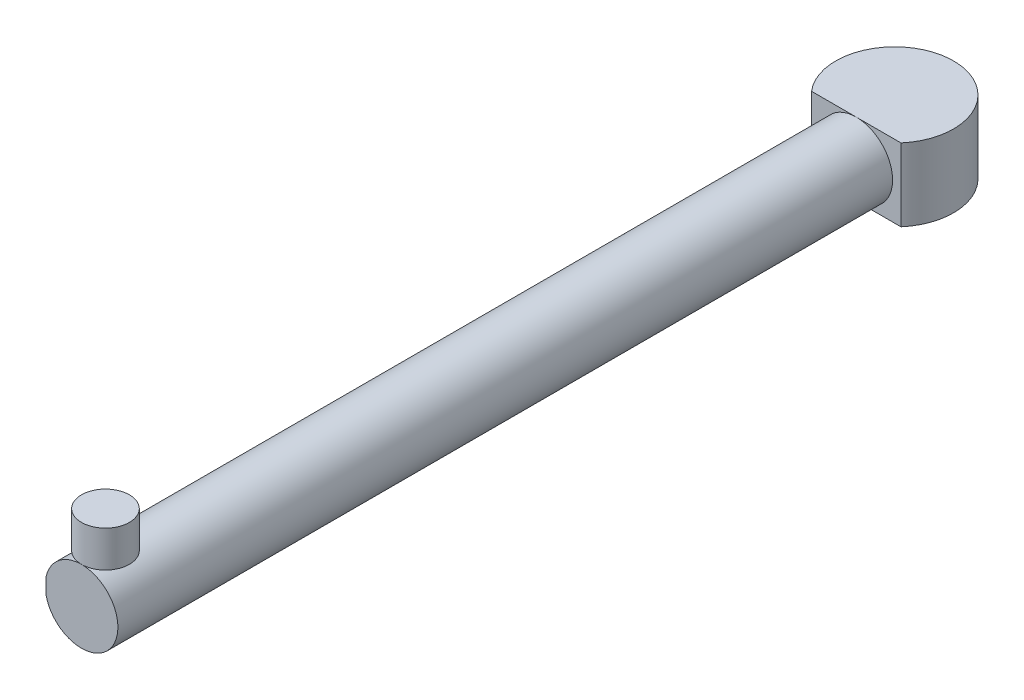
ISO-10303-21;
HEADER;
FILE_DESCRIPTION(('STEP AP214'),'2;1');
FILE_NAME('part.step','',(''),(''),'','','');
FILE_SCHEMA(('AUTOMOTIVE_DESIGN { 1 0 10303 214 1 1 1 1 }'));
ENDSEC;
DATA;
#1=APPLICATION_CONTEXT('core data for automotive mechanical design processes');
#2=APPLICATION_PROTOCOL_DEFINITION('international standard','automotive_design',2000,#1);
#3=PRODUCT_CONTEXT('',#1,'mechanical');
#4=PRODUCT('Part','Part','',(#3));
#5=PRODUCT_RELATED_PRODUCT_CATEGORY('part','',(#4));
#6=PRODUCT_DEFINITION_FORMATION('','',#4);
#7=PRODUCT_DEFINITION_CONTEXT('part definition',#1,'design');
#8=PRODUCT_DEFINITION('design','',#6,#7);
#9=PRODUCT_DEFINITION_SHAPE('','',#8);
#10=(LENGTH_UNIT() NAMED_UNIT(*) SI_UNIT(.MILLI.,.METRE.));
#11=(NAMED_UNIT(*) PLANE_ANGLE_UNIT() SI_UNIT($,.RADIAN.));
#12=(NAMED_UNIT(*) SI_UNIT($,.STERADIAN.) SOLID_ANGLE_UNIT());
#13=UNCERTAINTY_MEASURE_WITH_UNIT(LENGTH_MEASURE(1.E-05),#10,'distance_accuracy_value','');
#14=(GEOMETRIC_REPRESENTATION_CONTEXT(3) GLOBAL_UNCERTAINTY_ASSIGNED_CONTEXT((#13)) GLOBAL_UNIT_ASSIGNED_CONTEXT((#10,
#11,#12)) REPRESENTATION_CONTEXT('',''));
#15=CARTESIAN_POINT('',(0.,0.,0.));
#16=DIRECTION('',(0.,0.,1.));
#17=DIRECTION('',(1.,0.,0.));
#18=AXIS2_PLACEMENT_3D('',#15,#16,#17);
#19=CARTESIAN_POINT('',(10.,30.,89.0052774013303));
#20=DIRECTION('',(0.,0.,-1.));
#21=DIRECTION('',(-1.,0.,0.));
#22=AXIS2_PLACEMENT_3D('',#19,#20,#21);
#23=PLANE('',#22);
#24=CARTESIAN_POINT('',(0.,10.,89.0052774013303));
#25=DIRECTION('',(0.,0.,-1.));
#26=DIRECTION('',(-1.,0.,0.));
#27=AXIS2_PLACEMENT_3D('',#24,#25,#26);
#28=CIRCLE('',#27,10.);
#29=CARTESIAN_POINT('',(-9.77221690676681,12.122210339976,89.0052774013303));
#30=VERTEX_POINT('',#29);
#31=CARTESIAN_POINT('',(-9.7722169067668,7.87778966002397,89.0052774013303));
#32=VERTEX_POINT('',#31);
#33=EDGE_CURVE('E129',#30,#32,#28,.T.);
#34=ORIENTED_EDGE('',*,*,#33,.F.);
#35=DIRECTION('',(0.,-1.,0.));
#36=VECTOR('',#35,1.);
#37=CARTESIAN_POINT('',(-9.7722169067668,30.,89.0052774013303));
#38=LINE('',#37,#36);
#39=EDGE_CURVE('E209',#30,#32,#38,.T.);
#40=ORIENTED_EDGE('',*,*,#39,.T.);
#41=EDGE_LOOP('',(#34,#40));
#42=FACE_BOUND('',#41,.T.);
#43=ADVANCED_FACE('F113',(#42),#23,.F.);
#44=CARTESIAN_POINT('',(-9.7722169067668,30.,75.8317862245712));
#45=DIRECTION('',(1.,0.,0.));
#46=DIRECTION('',(0.,0.,-1.));
#47=AXIS2_PLACEMENT_3D('',#44,#45,#46);
#48=PLANE('',#47);
#49=DIRECTION('',(0.,0.,-1.));
#50=VECTOR('',#49,1.);
#51=CARTESIAN_POINT('',(-9.77221690676681,12.122210339976,109.831786224571));
#52=LINE('',#51,#50);
#53=CARTESIAN_POINT('',(-9.77221690676681,12.122210339976,75.8317862245712));
#54=VERTEX_POINT('',#53);
#55=EDGE_CURVE('E116',#30,#54,#52,.T.);
#56=ORIENTED_EDGE('',*,*,#55,.T.);
#57=DIRECTION('',(0.,-1.,0.));
#58=VECTOR('',#57,1.);
#59=CARTESIAN_POINT('',(-9.7722169067668,30.,75.8317862245712));
#60=LINE('',#59,#58);
#61=CARTESIAN_POINT('',(-9.7722169067668,7.87778966002397,75.8317862245712));
#62=VERTEX_POINT('',#61);
#63=EDGE_CURVE('E193',#54,#62,#60,.T.);
#64=ORIENTED_EDGE('',*,*,#63,.T.);
#65=DIRECTION('',(0.,0.,-1.));
#66=VECTOR('',#65,1.);
#67=CARTESIAN_POINT('',(-9.7722169067668,7.87778966002397,109.831786224571));
#68=LINE('',#67,#66);
#69=EDGE_CURVE('E205',#32,#62,#68,.T.);
#70=ORIENTED_EDGE('',*,*,#69,.F.);
#71=ORIENTED_EDGE('',*,*,#39,.F.);
#72=EDGE_LOOP('',(#56,#64,#70,#71));
#73=FACE_BOUND('',#72,.T.);
#74=ADVANCED_FACE('F224',(#73),#48,.F.);
#75=CARTESIAN_POINT('',(12.3032134622241,20.,75.8317862245712));
#76=DIRECTION('',(0.,0.,1.));
#77=DIRECTION('',(1.,0.,0.));
#78=AXIS2_PLACEMENT_3D('',#75,#76,#77);
#79=PLANE('',#78);
#80=ORIENTED_EDGE('',*,*,#63,.F.);
#81=CARTESIAN_POINT('',(0.,10.,75.8317862245712));
#82=DIRECTION('',(0.,0.,1.));
#83=DIRECTION('',(1.,0.,0.));
#84=AXIS2_PLACEMENT_3D('',#81,#82,#83);
#85=CIRCLE('',#84,10.);
#86=EDGE_CURVE('E188',#54,#62,#85,.T.);
#87=ORIENTED_EDGE('',*,*,#86,.T.);
#88=EDGE_LOOP('',(#80,#87));
#89=FACE_BOUND('',#88,.T.);
#90=ADVANCED_FACE('F223',(#89),#79,.T.);
#91=CARTESIAN_POINT('',(0.,20.,-134.735510149278));
#92=DIRECTION('',(0.,1.,0.));
#93=DIRECTION('',(0.,0.,1.));
#94=AXIS2_PLACEMENT_3D('',#91,#92,#93);
#95=PLANE('',#94);
#96=DIRECTION('',(-1.,0.,0.));
#97=VECTOR('',#96,1.);
#98=CARTESIAN_POINT('',(0.,20.,-124.168213775429));
#99=LINE('',#98,#97);
#100=CARTESIAN_POINT('',(0.,20.,-124.168213775429));
#101=VERTEX_POINT('',#100);
#102=CARTESIAN_POINT('',(-12.3032134622241,20.,-124.168213775429));
#103=VERTEX_POINT('',#102);
#104=EDGE_CURVE('E164',#101,#103,#99,.T.);
#105=ORIENTED_EDGE('',*,*,#104,.F.);
#106=DIRECTION('',(-1.,0.,0.));
#107=VECTOR('',#106,1.);
#108=CARTESIAN_POINT('',(0.,20.,-124.168213775429));
#109=LINE('',#108,#107);
#110=CARTESIAN_POINT('',(12.3032134622241,20.,-124.168213775429));
#111=VERTEX_POINT('',#110);
#112=EDGE_CURVE('E13',#111,#101,#109,.T.);
#113=ORIENTED_EDGE('',*,*,#112,.F.);
#114=CARTESIAN_POINT('',(0.,20.,-134.735510149278));
#115=DIRECTION('',(0.,1.,0.));
#116=DIRECTION('',(0.,0.,1.));
#117=AXIS2_PLACEMENT_3D('',#114,#115,#116);
#118=CIRCLE('',#117,16.2184097293728);
#119=EDGE_CURVE('E183',#111,#103,#118,.T.);
#120=ORIENTED_EDGE('',*,*,#119,.T.);
#121=EDGE_LOOP('',(#105,#113,#120));
#122=FACE_BOUND('',#121,.T.);
#123=ADVANCED_FACE('F233',(#122),#95,.T.);
#124=CARTESIAN_POINT('',(0.,0.,-134.735510149278));
#125=DIRECTION('',(0.,1.,0.));
#126=DIRECTION('',(0.,0.,1.));
#127=AXIS2_PLACEMENT_3D('',#124,#125,#126);
#128=PLANE('',#127);
#129=DIRECTION('',(1.,0.,0.));
#130=VECTOR('',#129,1.);
#131=CARTESIAN_POINT('',(0.,0.,-124.168213775429));
#132=LINE('',#131,#130);
#133=CARTESIAN_POINT('',(0.,0.,-124.168213775429));
#134=VERTEX_POINT('',#133);
#135=CARTESIAN_POINT('',(12.3032134622241,0.,-124.168213775429));
#136=VERTEX_POINT('',#135);
#137=EDGE_CURVE('E123',#134,#136,#132,.T.);
#138=ORIENTED_EDGE('',*,*,#137,.F.);
#139=DIRECTION('',(1.,0.,0.));
#140=VECTOR('',#139,1.);
#141=CARTESIAN_POINT('',(0.,0.,-124.168213775429));
#142=LINE('',#141,#140);
#143=CARTESIAN_POINT('',(-12.3032134622241,0.,-124.168213775429));
#144=VERTEX_POINT('',#143);
#145=EDGE_CURVE('E162',#144,#134,#142,.T.);
#146=ORIENTED_EDGE('',*,*,#145,.F.);
#147=CARTESIAN_POINT('',(0.,0.,-134.735510149278));
#148=DIRECTION('',(0.,1.,0.));
#149=DIRECTION('',(0.,0.,1.));
#150=AXIS2_PLACEMENT_3D('',#147,#148,#149);
#151=CIRCLE('',#150,16.2184097293728);
#152=EDGE_CURVE('E175',#136,#144,#151,.T.);
#153=ORIENTED_EDGE('',*,*,#152,.F.);
#154=EDGE_LOOP('',(#138,#146,#153));
#155=FACE_BOUND('',#154,.T.);
#156=ADVANCED_FACE('F174',(#155),#128,.F.);
#157=CARTESIAN_POINT('',(0.,20.,-134.735510149278));
#158=DIRECTION('',(0.,-1.,0.));
#159=DIRECTION('',(0.,0.,-1.));
#160=AXIS2_PLACEMENT_3D('',#157,#158,#159);
#161=CYLINDRICAL_SURFACE('',#160,16.2184097293728);
#162=ORIENTED_EDGE('',*,*,#152,.T.);
#163=DIRECTION('',(0.,-1.,0.));
#164=VECTOR('',#163,1.);
#165=CARTESIAN_POINT('',(-12.3032134622241,20.,-124.168213775429));
#166=LINE('',#165,#164);
#167=EDGE_CURVE('E158',#103,#144,#166,.T.);
#168=ORIENTED_EDGE('',*,*,#167,.F.);
#169=ORIENTED_EDGE('',*,*,#119,.F.);
#170=DIRECTION('',(0.,-1.,0.));
#171=VECTOR('',#170,1.);
#172=CARTESIAN_POINT('',(12.3032134622241,20.,-124.168213775429));
#173=LINE('',#172,#171);
#174=EDGE_CURVE('E181',#111,#136,#173,.T.);
#175=ORIENTED_EDGE('',*,*,#174,.T.);
#176=EDGE_LOOP('',(#162,#168,#169,#175));
#177=FACE_BOUND('',#176,.T.);
#178=ADVANCED_FACE('F180',(#177),#161,.T.);
#179=CARTESIAN_POINT('',(0.,10.,-124.168213775429));
#180=DIRECTION('',(0.,0.,1.));
#181=DIRECTION('',(1.,0.,0.));
#182=AXIS2_PLACEMENT_3D('',#179,#180,#181);
#183=CYLINDRICAL_SURFACE('',#182,10.);
#184=ORIENTED_EDGE('',*,*,#86,.F.);
#185=ORIENTED_EDGE('',*,*,#55,.F.);
#186=ORIENTED_EDGE('',*,*,#33,.T.);
#187=ORIENTED_EDGE('',*,*,#69,.T.);
#188=EDGE_LOOP('',(#184,#185,#186,#187));
#189=FACE_BOUND('',#188,.T.);
#190=CARTESIAN_POINT('',(0.,10.,-124.168213775429));
#191=DIRECTION('',(0.,0.,1.));
#192=DIRECTION('',(1.,0.,0.));
#193=AXIS2_PLACEMENT_3D('',#190,#191,#192);
#194=CIRCLE('',#193,10.);
#195=EDGE_CURVE('E199',#134,#101,#194,.T.);
#196=ORIENTED_EDGE('',*,*,#195,.T.);
#197=CARTESIAN_POINT('',(0.,10.,-124.168213775429));
#198=DIRECTION('',(0.,0.,1.));
#199=DIRECTION('',(1.,0.,0.));
#200=AXIS2_PLACEMENT_3D('',#197,#198,#199);
#201=CIRCLE('',#200,10.);
#202=EDGE_CURVE('E197',#101,#134,#201,.T.);
#203=ORIENTED_EDGE('',*,*,#202,.T.);
#204=EDGE_LOOP('',(#196,#203));
#205=FACE_BOUND('',#204,.T.);
#206=ADVANCED_FACE('F217',(#189,#205),#183,.T.);
#207=CARTESIAN_POINT('',(0.,0.,-124.168213775429));
#208=DIRECTION('',(0.,0.,1.));
#209=DIRECTION('',(1.,0.,0.));
#210=AXIS2_PLACEMENT_3D('',#207,#208,#209);
#211=PLANE('',#210);
#212=ORIENTED_EDGE('',*,*,#202,.F.);
#213=ORIENTED_EDGE('',*,*,#104,.T.);
#214=ORIENTED_EDGE('',*,*,#167,.T.);
#215=ORIENTED_EDGE('',*,*,#145,.T.);
#216=EDGE_LOOP('',(#212,#213,#214,#215));
#217=FACE_BOUND('',#216,.T.);
#218=ADVANCED_FACE('F161',(#217),#211,.T.);
#219=CARTESIAN_POINT('',(0.,0.,-124.168213775429));
#220=DIRECTION('',(0.,0.,1.));
#221=DIRECTION('',(1.,0.,0.));
#222=AXIS2_PLACEMENT_3D('',#219,#220,#221);
#223=PLANE('',#222);
#224=ORIENTED_EDGE('',*,*,#195,.F.);
#225=ORIENTED_EDGE('',*,*,#137,.T.);
#226=ORIENTED_EDGE('',*,*,#174,.F.);
#227=ORIENTED_EDGE('',*,*,#112,.T.);
#228=EDGE_LOOP('',(#224,#225,#226,#227));
#229=FACE_BOUND('',#228,.T.);
#230=ADVANCED_FACE('F236',(#229),#223,.T.);
#231=CLOSED_SHELL('',(#43,#74,#90,#123,#156,#178,#206,#218,#230));
#232=MANIFOLD_SOLID_BREP('B2',#231);
#233=CARTESIAN_POINT('',(0.,30.,0.));
#234=DIRECTION('',(0.,-1.,0.));
#235=DIRECTION('',(0.,0.,-1.));
#236=AXIS2_PLACEMENT_3D('',#233,#234,#235);
#237=PLANE('',#236);
#238=CARTESIAN_POINT('',(0.,30.,82.4185318129508));
#239=DIRECTION('',(0.,1.,0.));
#240=DIRECTION('',(0.,0.,1.));
#241=AXIS2_PLACEMENT_3D('',#238,#239,#240);
#242=CIRCLE('',#241,6.58674558837956);
#243=CARTESIAN_POINT('',(0.,30.,89.0052774013303));
#244=VERTEX_POINT('',#243);
#245=EDGE_CURVE('E325',#244,#244,#242,.T.);
#246=ORIENTED_EDGE('',*,*,#245,.T.);
#247=EDGE_LOOP('',(#246));
#248=FACE_BOUND('',#247,.T.);
#249=ADVANCED_FACE('F322',(#248),#237,.F.);
#250=CARTESIAN_POINT('',(0.,20.,109.831786224571));
#251=DIRECTION('',(0.,1.,0.));
#252=DIRECTION('',(0.,0.,1.));
#253=AXIS2_PLACEMENT_3D('',#250,#251,#252);
#254=PLANE('',#253);
#255=CARTESIAN_POINT('',(0.,20.,82.4185318129508));
#256=DIRECTION('',(0.,1.,0.));
#257=DIRECTION('',(0.,0.,1.));
#258=AXIS2_PLACEMENT_3D('',#255,#256,#257);
#259=CIRCLE('',#258,6.58674558837956);
#260=CARTESIAN_POINT('',(0.,20.,89.0052774013303));
#261=VERTEX_POINT('',#260);
#262=EDGE_CURVE('E112',#261,#261,#259,.T.);
#263=ORIENTED_EDGE('',*,*,#262,.F.);
#264=EDGE_LOOP('',(#263));
#265=FACE_BOUND('',#264,.T.);
#266=ADVANCED_FACE('F337',(#265),#254,.F.);
#267=CARTESIAN_POINT('',(0.,20.,82.4185318129508));
#268=DIRECTION('',(0.,1.,0.));
#269=DIRECTION('',(0.,0.,1.));
#270=AXIS2_PLACEMENT_3D('',#267,#268,#269);
#271=CYLINDRICAL_SURFACE('',#270,6.58674558837956);
#272=ORIENTED_EDGE('',*,*,#245,.F.);
#273=EDGE_LOOP('',(#272));
#274=FACE_BOUND('',#273,.T.);
#275=ORIENTED_EDGE('',*,*,#262,.T.);
#276=EDGE_LOOP('',(#275));
#277=FACE_BOUND('',#276,.T.);
#278=ADVANCED_FACE('F335',(#274,#277),#271,.T.);
#279=CLOSED_SHELL('',(#249,#266,#278));
#280=MANIFOLD_SOLID_BREP('B7',#279);
#281=ADVANCED_BREP_SHAPE_REPRESENTATION('',(#18,#232,#280),#14);
#282=SHAPE_DEFINITION_REPRESENTATION(#9,#281);
ENDSEC;
END-ISO-10303-21;
